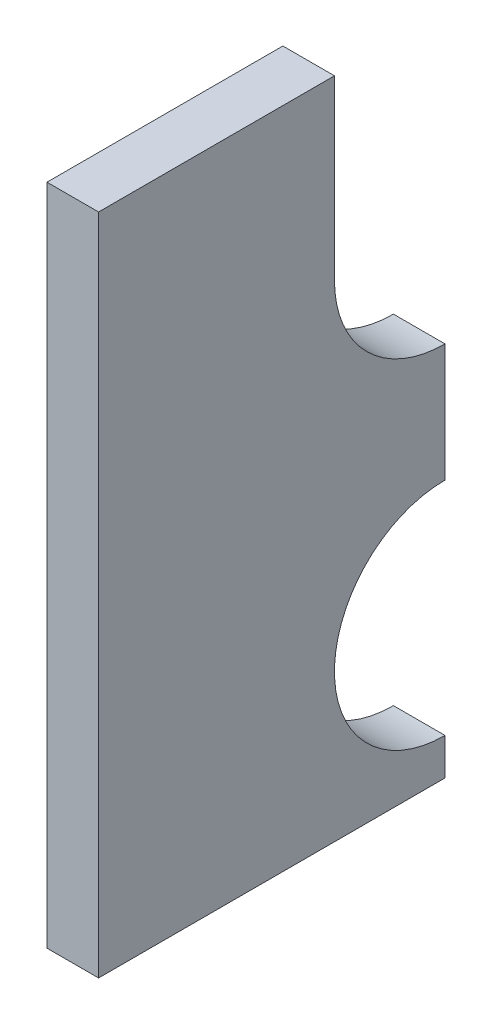
ISO-10303-21;
HEADER;
FILE_DESCRIPTION(('STEP AP214'),'2;1');
FILE_NAME('part.step','',(''),(''),'','','');
FILE_SCHEMA(('AUTOMOTIVE_DESIGN { 1 0 10303 214 1 1 1 1 }'));
ENDSEC;
DATA;
#1=APPLICATION_CONTEXT('core data for automotive mechanical design processes');
#2=APPLICATION_PROTOCOL_DEFINITION('international standard','automotive_design',2000,#1);
#3=PRODUCT_CONTEXT('',#1,'mechanical');
#4=PRODUCT('Part','Part','',(#3));
#5=PRODUCT_RELATED_PRODUCT_CATEGORY('part','',(#4));
#6=PRODUCT_DEFINITION_FORMATION('','',#4);
#7=PRODUCT_DEFINITION_CONTEXT('part definition',#1,'design');
#8=PRODUCT_DEFINITION('design','',#6,#7);
#9=PRODUCT_DEFINITION_SHAPE('','',#8);
#10=(LENGTH_UNIT() NAMED_UNIT(*) SI_UNIT(.MILLI.,.METRE.));
#11=(NAMED_UNIT(*) PLANE_ANGLE_UNIT() SI_UNIT($,.RADIAN.));
#12=(NAMED_UNIT(*) SI_UNIT($,.STERADIAN.) SOLID_ANGLE_UNIT());
#13=UNCERTAINTY_MEASURE_WITH_UNIT(LENGTH_MEASURE(1.E-05),#10,'distance_accuracy_value','');
#14=(GEOMETRIC_REPRESENTATION_CONTEXT(3) GLOBAL_UNCERTAINTY_ASSIGNED_CONTEXT((#13)) GLOBAL_UNIT_ASSIGNED_CONTEXT((#10,
#11,#12)) REPRESENTATION_CONTEXT('',''));
#15=CARTESIAN_POINT('',(0.,0.,0.));
#16=DIRECTION('',(0.,0.,1.));
#17=DIRECTION('',(1.,0.,0.));
#18=AXIS2_PLACEMENT_3D('',#15,#16,#17);
#19=CARTESIAN_POINT('',(0.,0.,0.));
#20=DIRECTION('',(0.,0.,1.));
#21=DIRECTION('',(1.,0.,0.));
#22=AXIS2_PLACEMENT_3D('',#19,#20,#21);
#23=PLANE('',#22);
#24=DIRECTION('',(0.,-1.,0.));
#25=VECTOR('',#24,1.);
#26=CARTESIAN_POINT('',(0.,0.,0.));
#27=LINE('',#26,#25);
#28=CARTESIAN_POINT('',(0.,-215.9,0.));
#29=VERTEX_POINT('',#28);
#30=CARTESIAN_POINT('',(0.,-228.6,0.));
#31=VERTEX_POINT('',#30);
#32=EDGE_CURVE('E114',#29,#31,#27,.T.);
#33=ORIENTED_EDGE('',*,*,#32,.F.);
#34=DIRECTION('',(1.,0.,0.));
#35=VECTOR('',#34,1.);
#36=CARTESIAN_POINT('',(0.,-215.9,0.));
#37=LINE('',#36,#35);
#38=CARTESIAN_POINT('',(17.78,-215.9,0.));
#39=VERTEX_POINT('',#38);
#40=EDGE_CURVE('E144',#29,#39,#37,.T.);
#41=ORIENTED_EDGE('',*,*,#40,.T.);
#42=DIRECTION('',(0.,1.,0.));
#43=VECTOR('',#42,1.);
#44=CARTESIAN_POINT('',(17.78,0.,0.));
#45=LINE('',#44,#43);
#46=CARTESIAN_POINT('',(17.78,-228.6,0.));
#47=VERTEX_POINT('',#46);
#48=EDGE_CURVE('E122',#47,#39,#45,.T.);
#49=ORIENTED_EDGE('',*,*,#48,.F.);
#50=DIRECTION('',(1.,0.,0.));
#51=VECTOR('',#50,1.);
#52=CARTESIAN_POINT('',(0.,-228.6,0.));
#53=LINE('',#52,#51);
#54=EDGE_CURVE('E113',#31,#47,#53,.T.);
#55=ORIENTED_EDGE('',*,*,#54,.F.);
#56=EDGE_LOOP('',(#33,#41,#49,#55));
#57=FACE_BOUND('',#56,.T.);
#58=ADVANCED_FACE('F32',(#57),#23,.F.);
#59=CARTESIAN_POINT('',(0.,0.,119.38));
#60=DIRECTION('',(1.,0.,0.));
#61=DIRECTION('',(0.,1.,0.));
#62=AXIS2_PLACEMENT_3D('',#59,#60,#61);
#63=PLANE('',#62);
#64=DIRECTION('',(0.,-1.,0.));
#65=VECTOR('',#64,1.);
#66=CARTESIAN_POINT('',(0.,-60.96,38.1));
#67=LINE('',#66,#65);
#68=CARTESIAN_POINT('',(0.,0.,38.1));
#69=VERTEX_POINT('',#68);
#70=CARTESIAN_POINT('',(0.,-60.96,38.1));
#71=VERTEX_POINT('',#70);
#72=EDGE_CURVE('E105',#69,#71,#67,.T.);
#73=ORIENTED_EDGE('',*,*,#72,.T.);
#74=CARTESIAN_POINT('',(0.,-60.96,0.));
#75=DIRECTION('',(1.,0.,0.));
#76=DIRECTION('',(0.,1.,0.));
#77=AXIS2_PLACEMENT_3D('',#74,#75,#76);
#78=CIRCLE('',#77,38.1);
#79=CARTESIAN_POINT('',(0.,-99.06,0.));
#80=VERTEX_POINT('',#79);
#81=EDGE_CURVE('E99',#71,#80,#78,.T.);
#82=ORIENTED_EDGE('',*,*,#81,.T.);
#83=CARTESIAN_POINT('',(0.,-139.7,0.));
#84=VERTEX_POINT('',#83);
#85=EDGE_CURVE('E55',#80,#84,#27,.T.);
#86=ORIENTED_EDGE('',*,*,#85,.T.);
#87=CARTESIAN_POINT('',(0.,-177.8,0.));
#88=DIRECTION('',(1.,0.,0.));
#89=DIRECTION('',(0.,1.,0.));
#90=AXIS2_PLACEMENT_3D('',#87,#88,#89);
#91=CIRCLE('',#90,38.1);
#92=EDGE_CURVE('E146',#84,#29,#91,.T.);
#93=ORIENTED_EDGE('',*,*,#92,.T.);
#94=ORIENTED_EDGE('',*,*,#32,.T.);
#95=DIRECTION('',(0.,0.,-1.));
#96=VECTOR('',#95,1.);
#97=CARTESIAN_POINT('',(0.,-228.6,119.38));
#98=LINE('',#97,#96);
#99=CARTESIAN_POINT('',(0.,-228.6,119.38));
#100=VERTEX_POINT('',#99);
#101=EDGE_CURVE('E11',#100,#31,#98,.T.);
#102=ORIENTED_EDGE('',*,*,#101,.F.);
#103=DIRECTION('',(0.,-1.,0.));
#104=VECTOR('',#103,1.);
#105=CARTESIAN_POINT('',(0.,0.,119.38));
#106=LINE('',#105,#104);
#107=CARTESIAN_POINT('',(0.,0.,119.38));
#108=VERTEX_POINT('',#107);
#109=EDGE_CURVE('E125',#108,#100,#106,.T.);
#110=ORIENTED_EDGE('',*,*,#109,.F.);
#111=DIRECTION('',(0.,0.,-1.));
#112=VECTOR('',#111,1.);
#113=CARTESIAN_POINT('',(0.,0.,119.38));
#114=LINE('',#113,#112);
#115=EDGE_CURVE('E126',#108,#69,#114,.T.);
#116=ORIENTED_EDGE('',*,*,#115,.T.);
#117=EDGE_LOOP('',(#73,#82,#86,#93,#94,#102,#110,#116));
#118=FACE_BOUND('',#117,.T.);
#119=ADVANCED_FACE('F34',(#118),#63,.F.);
#120=CARTESIAN_POINT('',(0.,-228.6,119.38));
#121=DIRECTION('',(0.,1.,0.));
#122=DIRECTION('',(0.,0.,1.));
#123=AXIS2_PLACEMENT_3D('',#120,#121,#122);
#124=PLANE('',#123);
#125=ORIENTED_EDGE('',*,*,#54,.T.);
#126=DIRECTION('',(0.,0.,-1.));
#127=VECTOR('',#126,1.);
#128=CARTESIAN_POINT('',(17.78,-228.6,119.38));
#129=LINE('',#128,#127);
#130=CARTESIAN_POINT('',(17.78,-228.6,119.38));
#131=VERTEX_POINT('',#130);
#132=EDGE_CURVE('E40',#131,#47,#129,.T.);
#133=ORIENTED_EDGE('',*,*,#132,.F.);
#134=DIRECTION('',(1.,0.,0.));
#135=VECTOR('',#134,1.);
#136=CARTESIAN_POINT('',(0.,-228.6,119.38));
#137=LINE('',#136,#135);
#138=EDGE_CURVE('E155',#100,#131,#137,.T.);
#139=ORIENTED_EDGE('',*,*,#138,.F.);
#140=ORIENTED_EDGE('',*,*,#101,.T.);
#141=EDGE_LOOP('',(#125,#133,#139,#140));
#142=FACE_BOUND('',#141,.T.);
#143=ADVANCED_FACE('F165',(#142),#124,.F.);
#144=CARTESIAN_POINT('',(17.78,0.,119.38));
#145=DIRECTION('',(-1.,0.,0.));
#146=DIRECTION('',(0.,-1.,0.));
#147=AXIS2_PLACEMENT_3D('',#144,#145,#146);
#148=PLANE('',#147);
#149=CARTESIAN_POINT('',(17.78,-139.7,0.));
#150=VERTEX_POINT('',#149);
#151=CARTESIAN_POINT('',(17.78,-99.06,0.));
#152=VERTEX_POINT('',#151);
#153=EDGE_CURVE('E116',#150,#152,#45,.T.);
#154=ORIENTED_EDGE('',*,*,#153,.T.);
#155=CARTESIAN_POINT('',(17.78,-60.96,0.));
#156=DIRECTION('',(1.,0.,0.));
#157=DIRECTION('',(0.,1.,0.));
#158=AXIS2_PLACEMENT_3D('',#155,#156,#157);
#159=CIRCLE('',#158,38.1);
#160=CARTESIAN_POINT('',(17.78,-60.96,38.1));
#161=VERTEX_POINT('',#160);
#162=EDGE_CURVE('E47',#161,#152,#159,.T.);
#163=ORIENTED_EDGE('',*,*,#162,.F.);
#164=DIRECTION('',(0.,-1.,0.));
#165=VECTOR('',#164,1.);
#166=CARTESIAN_POINT('',(17.78,-60.96,38.1));
#167=LINE('',#166,#165);
#168=CARTESIAN_POINT('',(17.78,0.,38.1));
#169=VERTEX_POINT('',#168);
#170=EDGE_CURVE('E108',#169,#161,#167,.T.);
#171=ORIENTED_EDGE('',*,*,#170,.F.);
#172=DIRECTION('',(0.,0.,-1.));
#173=VECTOR('',#172,1.);
#174=CARTESIAN_POINT('',(17.78,0.,119.38));
#175=LINE('',#174,#173);
#176=CARTESIAN_POINT('',(17.78,0.,119.38));
#177=VERTEX_POINT('',#176);
#178=EDGE_CURVE('E128',#177,#169,#175,.T.);
#179=ORIENTED_EDGE('',*,*,#178,.F.);
#180=DIRECTION('',(0.,1.,0.));
#181=VECTOR('',#180,1.);
#182=CARTESIAN_POINT('',(17.78,0.,119.38));
#183=LINE('',#182,#181);
#184=EDGE_CURVE('E138',#131,#177,#183,.T.);
#185=ORIENTED_EDGE('',*,*,#184,.F.);
#186=ORIENTED_EDGE('',*,*,#132,.T.);
#187=ORIENTED_EDGE('',*,*,#48,.T.);
#188=CARTESIAN_POINT('',(17.78,-177.8,0.));
#189=DIRECTION('',(1.,0.,0.));
#190=DIRECTION('',(0.,1.,0.));
#191=AXIS2_PLACEMENT_3D('',#188,#189,#190);
#192=CIRCLE('',#191,38.1);
#193=EDGE_CURVE('E149',#150,#39,#192,.T.);
#194=ORIENTED_EDGE('',*,*,#193,.F.);
#195=EDGE_LOOP('',(#154,#163,#171,#179,#185,#186,#187,#194));
#196=FACE_BOUND('',#195,.T.);
#197=ADVANCED_FACE('F135',(#196),#148,.F.);
#198=CARTESIAN_POINT('',(0.,0.,119.38));
#199=DIRECTION('',(0.,-1.,0.));
#200=DIRECTION('',(0.,0.,-1.));
#201=AXIS2_PLACEMENT_3D('',#198,#199,#200);
#202=PLANE('',#201);
#203=ORIENTED_EDGE('',*,*,#178,.T.);
#204=DIRECTION('',(1.,0.,0.));
#205=VECTOR('',#204,1.);
#206=CARTESIAN_POINT('',(0.,0.,38.1));
#207=LINE('',#206,#205);
#208=EDGE_CURVE('E104',#69,#169,#207,.T.);
#209=ORIENTED_EDGE('',*,*,#208,.F.);
#210=ORIENTED_EDGE('',*,*,#115,.F.);
#211=DIRECTION('',(-1.,0.,0.));
#212=VECTOR('',#211,1.);
#213=CARTESIAN_POINT('',(0.,0.,119.38));
#214=LINE('',#213,#212);
#215=EDGE_CURVE('E119',#177,#108,#214,.T.);
#216=ORIENTED_EDGE('',*,*,#215,.F.);
#217=EDGE_LOOP('',(#203,#209,#210,#216));
#218=FACE_BOUND('',#217,.T.);
#219=ADVANCED_FACE('F164',(#218),#202,.F.);
#220=CARTESIAN_POINT('',(0.,0.,119.38));
#221=DIRECTION('',(0.,0.,1.));
#222=DIRECTION('',(1.,0.,0.));
#223=AXIS2_PLACEMENT_3D('',#220,#221,#222);
#224=PLANE('',#223);
#225=ORIENTED_EDGE('',*,*,#109,.T.);
#226=ORIENTED_EDGE('',*,*,#138,.T.);
#227=ORIENTED_EDGE('',*,*,#184,.T.);
#228=ORIENTED_EDGE('',*,*,#215,.T.);
#229=EDGE_LOOP('',(#225,#226,#227,#228));
#230=FACE_BOUND('',#229,.T.);
#231=ADVANCED_FACE('F159',(#230),#224,.T.);
#232=ORIENTED_EDGE('',*,*,#85,.F.);
#233=DIRECTION('',(1.,0.,0.));
#234=VECTOR('',#233,1.);
#235=CARTESIAN_POINT('',(0.,-99.06,0.));
#236=LINE('',#235,#234);
#237=EDGE_CURVE('E97',#80,#152,#236,.T.);
#238=ORIENTED_EDGE('',*,*,#237,.T.);
#239=ORIENTED_EDGE('',*,*,#153,.F.);
#240=DIRECTION('',(1.,0.,0.));
#241=VECTOR('',#240,1.);
#242=CARTESIAN_POINT('',(0.,-139.7,0.));
#243=LINE('',#242,#241);
#244=EDGE_CURVE('E112',#84,#150,#243,.T.);
#245=ORIENTED_EDGE('',*,*,#244,.F.);
#246=EDGE_LOOP('',(#232,#238,#239,#245));
#247=FACE_BOUND('',#246,.T.);
#248=ADVANCED_FACE('F111',(#247),#23,.F.);
#249=CARTESIAN_POINT('',(0.,-177.8,0.));
#250=DIRECTION('',(1.,0.,0.));
#251=DIRECTION('',(0.,1.,0.));
#252=AXIS2_PLACEMENT_3D('',#249,#250,#251);
#253=CYLINDRICAL_SURFACE('',#252,38.1);
#254=ORIENTED_EDGE('',*,*,#193,.T.);
#255=ORIENTED_EDGE('',*,*,#40,.F.);
#256=ORIENTED_EDGE('',*,*,#92,.F.);
#257=ORIENTED_EDGE('',*,*,#244,.T.);
#258=EDGE_LOOP('',(#254,#255,#256,#257));
#259=FACE_BOUND('',#258,.T.);
#260=ADVANCED_FACE('F179',(#259),#253,.F.);
#261=CARTESIAN_POINT('',(0.,-60.96,0.));
#262=DIRECTION('',(1.,0.,0.));
#263=DIRECTION('',(0.,1.,0.));
#264=AXIS2_PLACEMENT_3D('',#261,#262,#263);
#265=CYLINDRICAL_SURFACE('',#264,38.1);
#266=ORIENTED_EDGE('',*,*,#162,.T.);
#267=ORIENTED_EDGE('',*,*,#237,.F.);
#268=ORIENTED_EDGE('',*,*,#81,.F.);
#269=DIRECTION('',(1.,0.,0.));
#270=VECTOR('',#269,1.);
#271=CARTESIAN_POINT('',(0.,-60.96,38.1));
#272=LINE('',#271,#270);
#273=EDGE_CURVE('E198',#71,#161,#272,.T.);
#274=ORIENTED_EDGE('',*,*,#273,.T.);
#275=EDGE_LOOP('',(#266,#267,#268,#274));
#276=FACE_BOUND('',#275,.T.);
#277=ADVANCED_FACE('F98',(#276),#265,.F.);
#278=CARTESIAN_POINT('',(0.,-60.96,38.1));
#279=DIRECTION('',(0.,0.,1.));
#280=DIRECTION('',(0.,-1.,0.));
#281=AXIS2_PLACEMENT_3D('',#278,#279,#280);
#282=PLANE('',#281);
#283=ORIENTED_EDGE('',*,*,#170,.T.);
#284=ORIENTED_EDGE('',*,*,#273,.F.);
#285=ORIENTED_EDGE('',*,*,#72,.F.);
#286=ORIENTED_EDGE('',*,*,#208,.T.);
#287=EDGE_LOOP('',(#283,#284,#285,#286));
#288=FACE_BOUND('',#287,.T.);
#289=ADVANCED_FACE('F191',(#288),#282,.F.);
#290=CLOSED_SHELL('',(#58,#119,#143,#197,#219,#231,#248,#260,#277,#289));
#291=MANIFOLD_SOLID_BREP('B2',#290);
#292=ADVANCED_BREP_SHAPE_REPRESENTATION('',(#18,#291),#14);
#293=SHAPE_DEFINITION_REPRESENTATION(#9,#292);
ENDSEC;
END-ISO-10303-21;
